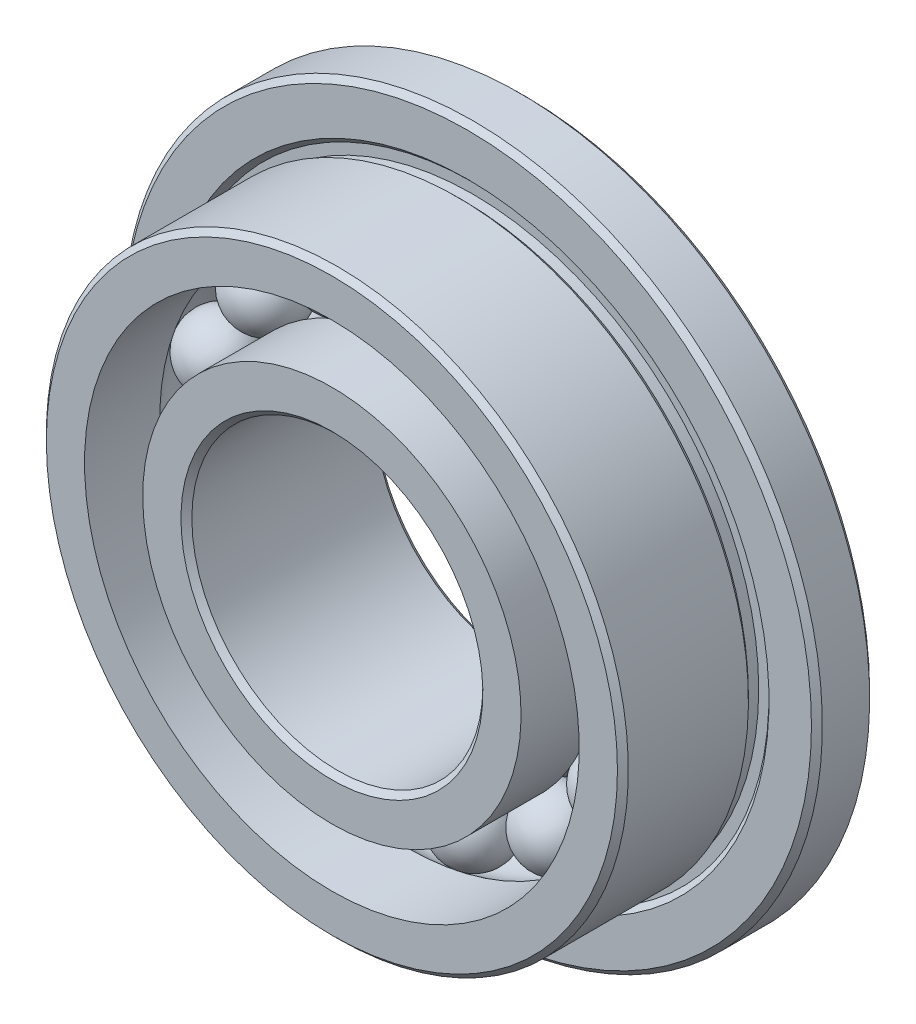
ISO-10303-21;
HEADER;
FILE_DESCRIPTION(('STEP AP214'),'2;1');
FILE_NAME('part.step','',(''),(''),'','','');
FILE_SCHEMA(('AUTOMOTIVE_DESIGN { 1 0 10303 214 1 1 1 1 }'));
ENDSEC;
DATA;
#1=APPLICATION_CONTEXT('core data for automotive mechanical design processes');
#2=APPLICATION_PROTOCOL_DEFINITION('international standard','automotive_design',2000,#1);
#3=PRODUCT_CONTEXT('',#1,'mechanical');
#4=PRODUCT('Part','Part','',(#3));
#5=PRODUCT_RELATED_PRODUCT_CATEGORY('part','',(#4));
#6=PRODUCT_DEFINITION_FORMATION('','',#4);
#7=PRODUCT_DEFINITION_CONTEXT('part definition',#1,'design');
#8=PRODUCT_DEFINITION('design','',#6,#7);
#9=PRODUCT_DEFINITION_SHAPE('','',#8);
#10=(LENGTH_UNIT() NAMED_UNIT(*) SI_UNIT(.MILLI.,.METRE.));
#11=(NAMED_UNIT(*) PLANE_ANGLE_UNIT() SI_UNIT($,.RADIAN.));
#12=(NAMED_UNIT(*) SI_UNIT($,.STERADIAN.) SOLID_ANGLE_UNIT());
#13=UNCERTAINTY_MEASURE_WITH_UNIT(LENGTH_MEASURE(1.E-05),#10,'distance_accuracy_value','');
#14=(GEOMETRIC_REPRESENTATION_CONTEXT(3) GLOBAL_UNCERTAINTY_ASSIGNED_CONTEXT((#13)) GLOBAL_UNIT_ASSIGNED_CONTEXT((#10,
#11,#12)) REPRESENTATION_CONTEXT('',''));
#15=CARTESIAN_POINT('',(0.,0.,0.));
#16=DIRECTION('',(0.,0.,1.));
#17=DIRECTION('',(1.,0.,0.));
#18=AXIS2_PLACEMENT_3D('',#15,#16,#17);
#19=CARTESIAN_POINT('',(-0.915157446920525,2.05547727969586,0.));
#20=DIRECTION('',(-0.406736643075789,0.913545457642606,0.));
#21=DIRECTION('',(0.913545457642606,0.406736643075789,0.));
#22=AXIS2_PLACEMENT_3D('',#19,#20,#21);
#23=SPHERICAL_SURFACE('',#22,0.375);
#24=CARTESIAN_POINT('',(-1.06768368807395,2.39805682631184,0.));
#25=VERTEX_POINT('',#24);
#26=VERTEX_LOOP('',#25);
#27=FACE_BOUND('',#26,.T.);
#28=ADVANCED_FACE('F43',(#27),#23,.T.);
#29=CLOSED_SHELL('',(#28));
#30=MANIFOLD_SOLID_BREP('B2',#29);
#31=CARTESIAN_POINT('',(-1.67207585732412,1.50554386430745,0.));
#32=DIRECTION('',(-0.743144825477386,0.669130606358867,0.));
#33=DIRECTION('',(0.669130606358867,0.743144825477386,0.));
#34=AXIS2_PLACEMENT_3D('',#31,#32,#33);
#35=SPHERICAL_SURFACE('',#34,0.375);
#36=CARTESIAN_POINT('',(-1.95075516687814,1.75646784169203,0.));
#37=VERTEX_POINT('',#36);
#38=VERTEX_LOOP('',#37);
#39=FACE_BOUND('',#38,.T.);
#40=ADVANCED_FACE('F62',(#39),#35,.T.);
#41=CLOSED_SHELL('',(#40));
#42=MANIFOLD_SOLID_BREP('B7',#41);
#43=CARTESIAN_POINT('',(-2.13987716166409,0.695288237343654,0.));
#44=DIRECTION('',(-0.95105651629515,0.309016994374957,0.));
#45=DIRECTION('',(0.309016994374957,0.95105651629515,0.));
#46=AXIS2_PLACEMENT_3D('',#43,#44,#45);
#47=SPHERICAL_SURFACE('',#46,0.375);
#48=CARTESIAN_POINT('',(-2.49652335527477,0.811169610234263,0.));
#49=VERTEX_POINT('',#48);
#50=VERTEX_LOOP('',#49);
#51=FACE_BOUND('',#50,.T.);
#52=ADVANCED_FACE('F81',(#51),#47,.T.);
#53=CLOSED_SHELL('',(#52));
#54=MANIFOLD_SOLID_BREP('B39',#53);
#55=CARTESIAN_POINT('',(-2.23767426457862,-0.235189042352198,0.));
#56=DIRECTION('',(-0.994521895368274,-0.104528463267644,0.));
#57=DIRECTION('',(-0.104528463267644,0.994521895368274,0.));
#58=AXIS2_PLACEMENT_3D('',#55,#56,#57);
#59=SPHERICAL_SURFACE('',#58,0.375);
#60=CARTESIAN_POINT('',(-2.61061997534172,-0.274387216077565,0.));
#61=VERTEX_POINT('',#60);
#62=VERTEX_LOOP('',#61);
#63=FACE_BOUND('',#62,.T.);
#64=ADVANCED_FACE('F100',(#63),#59,.T.);
#65=CLOSED_SHELL('',(#64));
#66=MANIFOLD_SOLID_BREP('B58',#65);
#67=CARTESIAN_POINT('',(-1.948557158515,-1.12499999999998,0.));
#68=DIRECTION('',(-0.866025403784443,-0.499999999999992,0.));
#69=DIRECTION('',(-0.499999999999992,0.866025403784443,0.));
#70=AXIS2_PLACEMENT_3D('',#67,#68,#69);
#71=SPHERICAL_SURFACE('',#70,0.375);
#72=CARTESIAN_POINT('',(-2.27331668493416,-1.31249999999998,0.));
#73=VERTEX_POINT('',#72);
#74=VERTEX_LOOP('',#73);
#75=FACE_BOUND('',#74,.T.);
#76=ADVANCED_FACE('F119',(#75),#71,.T.);
#77=CLOSED_SHELL('',(#76));
#78=MANIFOLD_SOLID_BREP('B77',#77);
#79=CARTESIAN_POINT('',(-1.32251681765808,-1.82028823734362,0.));
#80=DIRECTION('',(-0.58778525229248,-0.809016994374943,0.));
#81=DIRECTION('',(-0.809016994374943,0.58778525229248,0.));
#82=AXIS2_PLACEMENT_3D('',#79,#80,#81);
#83=SPHERICAL_SURFACE('',#82,0.375);
#84=CARTESIAN_POINT('',(-1.54293628726776,-2.12366961023422,0.));
#85=VERTEX_POINT('',#84);
#86=VERTEX_LOOP('',#85);
#87=FACE_BOUND('',#86,.T.);
#88=ADVANCED_FACE('F138',(#87),#83,.T.);
#89=CLOSED_SHELL('',(#88));
#90=MANIFOLD_SOLID_BREP('B96',#89);
#91=CARTESIAN_POINT('',(-0.467801304339975,-2.20083210165106,0.));
#92=DIRECTION('',(-0.207911690817766,-0.978147600733804,0.));
#93=DIRECTION('',(-0.978147600733804,0.207911690817766,0.));
#94=AXIS2_PLACEMENT_3D('',#91,#92,#93);
#95=SPHERICAL_SURFACE('',#94,0.375);
#96=CARTESIAN_POINT('',(-0.545768188396637,-2.56763745192624,0.));
#97=VERTEX_POINT('',#96);
#98=VERTEX_LOOP('',#97);
#99=FACE_BOUND('',#98,.T.);
#100=ADVANCED_FACE('F157',(#99),#95,.T.);
#101=CLOSED_SHELL('',(#100));
#102=MANIFOLD_SOLID_BREP('B115',#101);
#103=CARTESIAN_POINT('',(0.467801304339945,-2.20083210165107,0.));
#104=DIRECTION('',(0.207911690817753,-0.978147600733807,0.));
#105=DIRECTION('',(-0.978147600733807,-0.207911690817753,0.));
#106=AXIS2_PLACEMENT_3D('',#103,#104,#105);
#107=SPHERICAL_SURFACE('',#106,0.375);
#108=CARTESIAN_POINT('',(0.545768188396602,-2.56763745192624,0.));
#109=VERTEX_POINT('',#108);
#110=VERTEX_LOOP('',#109);
#111=FACE_BOUND('',#110,.T.);
#112=ADVANCED_FACE('F176',(#111),#107,.T.);
#113=CLOSED_SHELL('',(#112));
#114=MANIFOLD_SOLID_BREP('B134',#113);
#115=CARTESIAN_POINT('',(1.32251681765806,-1.82028823734364,0.));
#116=DIRECTION('',(0.587785252292469,-0.80901699437495,0.));
#117=DIRECTION('',(-0.80901699437495,-0.587785252292469,0.));
#118=AXIS2_PLACEMENT_3D('',#115,#116,#117);
#119=SPHERICAL_SURFACE('',#118,0.375);
#120=CARTESIAN_POINT('',(1.54293628726773,-2.12366961023424,0.));
#121=VERTEX_POINT('',#120);
#122=VERTEX_LOOP('',#121);
#123=FACE_BOUND('',#122,.T.);
#124=ADVANCED_FACE('F195',(#123),#119,.T.);
#125=CLOSED_SHELL('',(#124));
#126=MANIFOLD_SOLID_BREP('B153',#125);
#127=CARTESIAN_POINT('',(1.94855715851498,-1.12500000000001,0.));
#128=DIRECTION('',(0.866025403784437,-0.500000000000004,0.));
#129=DIRECTION('',(-0.500000000000004,-0.866025403784437,0.));
#130=AXIS2_PLACEMENT_3D('',#127,#128,#129);
#131=SPHERICAL_SURFACE('',#130,0.375);
#132=CARTESIAN_POINT('',(2.27331668493415,-1.31250000000001,0.));
#133=VERTEX_POINT('',#132);
#134=VERTEX_LOOP('',#133);
#135=FACE_BOUND('',#134,.T.);
#136=ADVANCED_FACE('F213',(#135),#131,.T.);
#137=CLOSED_SHELL('',(#136));
#138=MANIFOLD_SOLID_BREP('B172',#137);
#139=CARTESIAN_POINT('',(2.23767426457861,-0.235189042352228,0.));
#140=DIRECTION('',(0.994521895368273,-0.104528463267657,0.));
#141=DIRECTION('',(-0.104528463267657,-0.994521895368273,0.));
#142=AXIS2_PLACEMENT_3D('',#139,#140,#141);
#143=SPHERICAL_SURFACE('',#142,0.375);
#144=CARTESIAN_POINT('',(2.61061997534172,-0.2743872160776,0.));
#145=VERTEX_POINT('',#144);
#146=VERTEX_LOOP('',#145);
#147=FACE_BOUND('',#146,.T.);
#148=ADVANCED_FACE('F232',(#147),#143,.T.);
#149=CLOSED_SHELL('',(#148));
#150=MANIFOLD_SOLID_BREP('B191',#149);
#151=CARTESIAN_POINT('',(2.1398771616641,0.695288237343626,0.));
#152=DIRECTION('',(0.951056516295154,0.309016994374945,0.));
#153=DIRECTION('',(0.309016994374945,-0.951056516295154,0.));
#154=AXIS2_PLACEMENT_3D('',#151,#152,#153);
#155=SPHERICAL_SURFACE('',#154,0.375);
#156=CARTESIAN_POINT('',(2.49652335527478,0.811169610234231,0.));
#157=VERTEX_POINT('',#156);
#158=VERTEX_LOOP('',#157);
#159=FACE_BOUND('',#158,.T.);
#160=ADVANCED_FACE('F251',(#159),#155,.T.);
#161=CLOSED_SHELL('',(#160));
#162=MANIFOLD_SOLID_BREP('B209',#161);
#163=CARTESIAN_POINT('',(1.67207585732414,1.50554386430743,0.));
#164=DIRECTION('',(0.743144825477395,0.669130606358857,0.));
#165=DIRECTION('',(0.669130606358857,-0.743144825477395,0.));
#166=AXIS2_PLACEMENT_3D('',#163,#164,#165);
#167=SPHERICAL_SURFACE('',#166,0.375);
#168=CARTESIAN_POINT('',(1.95075516687816,1.756467841692,0.));
#169=VERTEX_POINT('',#168);
#170=VERTEX_LOOP('',#169);
#171=FACE_BOUND('',#170,.T.);
#172=ADVANCED_FACE('F269',(#171),#167,.T.);
#173=CLOSED_SHELL('',(#172));
#174=MANIFOLD_SOLID_BREP('B228',#173);
#175=CARTESIAN_POINT('',(0.915157446920552,2.05547727969585,0.));
#176=DIRECTION('',(0.406736643075801,0.913545457642601,0.));
#177=DIRECTION('',(0.913545457642601,-0.406736643075801,0.));
#178=AXIS2_PLACEMENT_3D('',#175,#176,#177);
#179=SPHERICAL_SURFACE('',#178,0.375);
#180=CARTESIAN_POINT('',(1.06768368807398,2.39805682631183,0.));
#181=VERTEX_POINT('',#180);
#182=VERTEX_LOOP('',#181);
#183=FACE_BOUND('',#182,.T.);
#184=ADVANCED_FACE('F287',(#183),#179,.T.);
#185=CLOSED_SHELL('',(#184));
#186=MANIFOLD_SOLID_BREP('B247',#185);
#187=CARTESIAN_POINT('',(0.,2.25,0.));
#188=DIRECTION('',(0.,1.,0.));
#189=DIRECTION('',(1.,0.,0.));
#190=AXIS2_PLACEMENT_3D('',#187,#188,#189);
#191=SPHERICAL_SURFACE('',#190,0.375);
#192=CARTESIAN_POINT('',(0.,2.625,0.));
#193=VERTEX_POINT('',#192);
#194=VERTEX_LOOP('',#193);
#195=FACE_BOUND('',#194,.T.);
#196=ADVANCED_FACE('F309',(#195),#191,.T.);
#197=CLOSED_SHELL('',(#196));
#198=MANIFOLD_SOLID_BREP('B265',#197);
#199=CARTESIAN_POINT('',(0.,0.,0.));
#200=DIRECTION('',(0.,0.,1.));
#201=DIRECTION('',(0.,-1.,0.));
#202=AXIS2_PLACEMENT_3D('',#199,#200,#201);
#203=CYLINDRICAL_SURFACE('',#202,1.95);
#204=CARTESIAN_POINT('',(0.,0.,-0.225000000000001));
#205=DIRECTION('',(0.,0.,1.));
#206=DIRECTION('',(0.,-1.,0.));
#207=AXIS2_PLACEMENT_3D('',#204,#205,#206);
#208=CIRCLE('',#207,1.95);
#209=CARTESIAN_POINT('',(0.,-1.95,-0.225000000000001));
#210=VERTEX_POINT('',#209);
#211=EDGE_CURVE('E357',#210,#210,#208,.T.);
#212=ORIENTED_EDGE('',*,*,#211,.F.);
#213=EDGE_LOOP('',(#212));
#214=FACE_BOUND('',#213,.T.);
#215=CARTESIAN_POINT('',(0.,0.,-1.));
#216=DIRECTION('',(0.,0.,1.));
#217=DIRECTION('',(0.,-1.,0.));
#218=AXIS2_PLACEMENT_3D('',#215,#216,#217);
#219=CIRCLE('',#218,1.95);
#220=CARTESIAN_POINT('',(0.,-1.95,-1.));
#221=VERTEX_POINT('',#220);
#222=EDGE_CURVE('E368',#221,#221,#219,.T.);
#223=ORIENTED_EDGE('',*,*,#222,.T.);
#224=EDGE_LOOP('',(#223));
#225=FACE_BOUND('',#224,.T.);
#226=ADVANCED_FACE('F331',(#214,#225),#203,.T.);
#227=CARTESIAN_POINT('',(0.,0.,0.));
#228=DIRECTION('',(0.,0.,1.));
#229=DIRECTION('',(0.,-1.,0.));
#230=AXIS2_PLACEMENT_3D('',#227,#228,#229);
#231=TOROIDAL_SURFACE('',#230,2.25,0.375);
#232=CARTESIAN_POINT('',(0.,0.,0.225));
#233=DIRECTION('',(0.,0.,1.));
#234=DIRECTION('',(0.,-1.,0.));
#235=AXIS2_PLACEMENT_3D('',#232,#233,#234);
#236=CIRCLE('',#235,1.95);
#237=CARTESIAN_POINT('',(0.,-1.95,0.225));
#238=VERTEX_POINT('',#237);
#239=EDGE_CURVE('E360',#238,#238,#236,.T.);
#240=ORIENTED_EDGE('',*,*,#239,.F.);
#241=EDGE_LOOP('',(#240));
#242=FACE_BOUND('',#241,.T.);
#243=ORIENTED_EDGE('',*,*,#211,.T.);
#244=EDGE_LOOP('',(#243));
#245=FACE_BOUND('',#244,.T.);
#246=ADVANCED_FACE('F387',(#242,#245),#231,.F.);
#247=CARTESIAN_POINT('',(0.,0.,0.));
#248=DIRECTION('',(0.,0.,1.));
#249=DIRECTION('',(0.,-1.,0.));
#250=AXIS2_PLACEMENT_3D('',#247,#248,#249);
#251=CYLINDRICAL_SURFACE('',#250,1.95);
#252=CARTESIAN_POINT('',(0.,0.,1.));
#253=DIRECTION('',(0.,0.,1.));
#254=DIRECTION('',(0.,-1.,0.));
#255=AXIS2_PLACEMENT_3D('',#252,#253,#254);
#256=CIRCLE('',#255,1.95);
#257=CARTESIAN_POINT('',(0.,-1.95,1.));
#258=VERTEX_POINT('',#257);
#259=EDGE_CURVE('E364',#258,#258,#256,.T.);
#260=ORIENTED_EDGE('',*,*,#259,.F.);
#261=EDGE_LOOP('',(#260));
#262=FACE_BOUND('',#261,.T.);
#263=ORIENTED_EDGE('',*,*,#239,.T.);
#264=EDGE_LOOP('',(#263));
#265=FACE_BOUND('',#264,.T.);
#266=ADVANCED_FACE('F393',(#262,#265),#251,.T.);
#267=CARTESIAN_POINT('',(0.,1.5,1.));
#268=DIRECTION('',(0.,0.,-1.));
#269=DIRECTION('',(0.,1.,0.));
#270=AXIS2_PLACEMENT_3D('',#267,#268,#269);
#271=PLANE('',#270);
#272=CARTESIAN_POINT('',(0.,0.,1.));
#273=DIRECTION('',(0.,0.,-1.));
#274=DIRECTION('',(0.,1.,0.));
#275=AXIS2_PLACEMENT_3D('',#272,#273,#274);
#276=CIRCLE('',#275,1.55625);
#277=CARTESIAN_POINT('',(0.,1.55625,1.));
#278=VERTEX_POINT('',#277);
#279=EDGE_CURVE('E308',#278,#278,#276,.T.);
#280=ORIENTED_EDGE('',*,*,#279,.T.);
#281=EDGE_LOOP('',(#280));
#282=FACE_BOUND('',#281,.T.);
#283=ORIENTED_EDGE('',*,*,#259,.T.);
#284=EDGE_LOOP('',(#283));
#285=FACE_BOUND('',#284,.T.);
#286=ADVANCED_FACE('F384',(#282,#285),#271,.F.);
#287=CARTESIAN_POINT('',(0.,0.,0.));
#288=DIRECTION('',(0.,0.,1.));
#289=DIRECTION('',(0.,-1.,0.));
#290=AXIS2_PLACEMENT_3D('',#287,#288,#289);
#291=CYLINDRICAL_SURFACE('',#290,1.5);
#292=CARTESIAN_POINT('',(0.,0.,-0.943750000000001));
#293=DIRECTION('',(0.,0.,1.));
#294=DIRECTION('',(0.,-1.,0.));
#295=AXIS2_PLACEMENT_3D('',#292,#293,#294);
#296=CIRCLE('',#295,1.5);
#297=CARTESIAN_POINT('',(0.,-1.5,-0.943750000000001));
#298=VERTEX_POINT('',#297);
#299=EDGE_CURVE('E339',#298,#298,#296,.F.);
#300=ORIENTED_EDGE('',*,*,#299,.T.);
#301=EDGE_LOOP('',(#300));
#302=FACE_BOUND('',#301,.T.);
#303=CARTESIAN_POINT('',(0.,0.,0.94375));
#304=DIRECTION('',(0.,0.,-1.));
#305=DIRECTION('',(0.,1.,0.));
#306=AXIS2_PLACEMENT_3D('',#303,#304,#305);
#307=CIRCLE('',#306,1.5);
#308=CARTESIAN_POINT('',(0.,1.5,0.94375));
#309=VERTEX_POINT('',#308);
#310=EDGE_CURVE('E346',#309,#309,#307,.F.);
#311=ORIENTED_EDGE('',*,*,#310,.T.);
#312=EDGE_LOOP('',(#311));
#313=FACE_BOUND('',#312,.T.);
#314=ADVANCED_FACE('F376',(#302,#313),#291,.F.);
#315=CARTESIAN_POINT('',(0.,1.95,-1.));
#316=DIRECTION('',(0.,0.,1.));
#317=DIRECTION('',(0.,-1.,0.));
#318=AXIS2_PLACEMENT_3D('',#315,#316,#317);
#319=PLANE('',#318);
#320=CARTESIAN_POINT('',(0.,0.,-1.));
#321=DIRECTION('',(0.,0.,1.));
#322=DIRECTION('',(0.,-1.,0.));
#323=AXIS2_PLACEMENT_3D('',#320,#321,#322);
#324=CIRCLE('',#323,1.55625);
#325=CARTESIAN_POINT('',(0.,-1.55625,-1.));
#326=VERTEX_POINT('',#325);
#327=EDGE_CURVE('E352',#326,#326,#324,.T.);
#328=ORIENTED_EDGE('',*,*,#327,.T.);
#329=EDGE_LOOP('',(#328));
#330=FACE_BOUND('',#329,.T.);
#331=ORIENTED_EDGE('',*,*,#222,.F.);
#332=EDGE_LOOP('',(#331));
#333=FACE_BOUND('',#332,.T.);
#334=ADVANCED_FACE('F373',(#330,#333),#319,.F.);
#335=CARTESIAN_POINT('',(0.,0.,-1.));
#336=DIRECTION('',(0.,0.,-1.));
#337=DIRECTION('',(0.,1.,0.));
#338=AXIS2_PLACEMENT_3D('',#335,#336,#337);
#339=CONICAL_SURFACE('',#338,1.55625,0.785398163397448);
#340=ORIENTED_EDGE('',*,*,#299,.F.);
#341=EDGE_LOOP('',(#340));
#342=FACE_BOUND('',#341,.T.);
#343=ORIENTED_EDGE('',*,*,#327,.F.);
#344=EDGE_LOOP('',(#343));
#345=FACE_BOUND('',#344,.T.);
#346=ADVANCED_FACE('F375',(#342,#345),#339,.F.);
#347=CARTESIAN_POINT('',(0.,0.,0.94375));
#348=DIRECTION('',(0.,0.,1.));
#349=DIRECTION('',(0.,-1.,0.));
#350=AXIS2_PLACEMENT_3D('',#347,#348,#349);
#351=CONICAL_SURFACE('',#350,1.5,0.78539816339745);
#352=ORIENTED_EDGE('',*,*,#279,.F.);
#353=EDGE_LOOP('',(#352));
#354=FACE_BOUND('',#353,.T.);
#355=ORIENTED_EDGE('',*,*,#310,.F.);
#356=EDGE_LOOP('',(#355));
#357=FACE_BOUND('',#356,.T.);
#358=ADVANCED_FACE('F333',(#354,#357),#351,.F.);
#359=CLOSED_SHELL('',(#226,#246,#266,#286,#314,#334,#346,#358));
#360=MANIFOLD_SOLID_BREP('B283',#359);
#361=CARTESIAN_POINT('',(0.,2.55,-1.));
#362=DIRECTION('',(0.,0.,1.));
#363=DIRECTION('',(0.,-1.,0.));
#364=AXIS2_PLACEMENT_3D('',#361,#362,#363);
#365=PLANE('',#364);
#366=CARTESIAN_POINT('',(0.,0.,-1.));
#367=DIRECTION('',(0.,0.,1.));
#368=DIRECTION('',(0.,-1.,0.));
#369=AXIS2_PLACEMENT_3D('',#366,#367,#368);
#370=CIRCLE('',#369,3.54375);
#371=CARTESIAN_POINT('',(0.,-3.54375,-1.));
#372=VERTEX_POINT('',#371);
#373=EDGE_CURVE('E488',#372,#372,#370,.F.);
#374=ORIENTED_EDGE('',*,*,#373,.T.);
#375=EDGE_LOOP('',(#374));
#376=FACE_BOUND('',#375,.T.);
#377=CARTESIAN_POINT('',(0.,0.,-1.));
#378=DIRECTION('',(0.,0.,1.));
#379=DIRECTION('',(0.,-1.,0.));
#380=AXIS2_PLACEMENT_3D('',#377,#378,#379);
#381=CIRCLE('',#380,2.55);
#382=CARTESIAN_POINT('',(0.,-2.55,-1.));
#383=VERTEX_POINT('',#382);
#384=EDGE_CURVE('E501',#383,#383,#381,.T.);
#385=ORIENTED_EDGE('',*,*,#384,.T.);
#386=EDGE_LOOP('',(#385));
#387=FACE_BOUND('',#386,.T.);
#388=ADVANCED_FACE('F469',(#376,#387),#365,.F.);
#389=CARTESIAN_POINT('',(0.,0.,0.));
#390=DIRECTION('',(0.,0.,1.));
#391=DIRECTION('',(0.,-1.,0.));
#392=AXIS2_PLACEMENT_3D('',#389,#390,#391);
#393=CYLINDRICAL_SURFACE('',#392,2.55);
#394=ORIENTED_EDGE('',*,*,#384,.F.);
#395=EDGE_LOOP('',(#394));
#396=FACE_BOUND('',#395,.T.);
#397=CARTESIAN_POINT('',(0.,0.,-0.225000000000001));
#398=DIRECTION('',(0.,0.,1.));
#399=DIRECTION('',(0.,-1.,0.));
#400=AXIS2_PLACEMENT_3D('',#397,#398,#399);
#401=CIRCLE('',#400,2.55);
#402=CARTESIAN_POINT('',(0.,-2.55,-0.225000000000001));
#403=VERTEX_POINT('',#402);
#404=EDGE_CURVE('E505',#403,#403,#401,.T.);
#405=ORIENTED_EDGE('',*,*,#404,.T.);
#406=EDGE_LOOP('',(#405));
#407=FACE_BOUND('',#406,.T.);
#408=ADVANCED_FACE('F556',(#396,#407),#393,.F.);
#409=CARTESIAN_POINT('',(0.,0.,0.));
#410=DIRECTION('',(0.,0.,1.));
#411=DIRECTION('',(0.,-1.,0.));
#412=AXIS2_PLACEMENT_3D('',#409,#410,#411);
#413=TOROIDAL_SURFACE('',#412,2.25,0.375);
#414=ORIENTED_EDGE('',*,*,#404,.F.);
#415=EDGE_LOOP('',(#414));
#416=FACE_BOUND('',#415,.T.);
#417=CARTESIAN_POINT('',(0.,0.,0.225));
#418=DIRECTION('',(0.,0.,1.));
#419=DIRECTION('',(0.,-1.,0.));
#420=AXIS2_PLACEMENT_3D('',#417,#418,#419);
#421=CIRCLE('',#420,2.55);
#422=CARTESIAN_POINT('',(0.,-2.55,0.225));
#423=VERTEX_POINT('',#422);
#424=EDGE_CURVE('E509',#423,#423,#421,.T.);
#425=ORIENTED_EDGE('',*,*,#424,.T.);
#426=EDGE_LOOP('',(#425));
#427=FACE_BOUND('',#426,.T.);
#428=ADVANCED_FACE('F562',(#416,#427),#413,.F.);
#429=CARTESIAN_POINT('',(0.,0.,0.));
#430=DIRECTION('',(0.,0.,1.));
#431=DIRECTION('',(0.,-1.,0.));
#432=AXIS2_PLACEMENT_3D('',#429,#430,#431);
#433=CYLINDRICAL_SURFACE('',#432,2.55);
#434=ORIENTED_EDGE('',*,*,#424,.F.);
#435=EDGE_LOOP('',(#434));
#436=FACE_BOUND('',#435,.T.);
#437=CARTESIAN_POINT('',(0.,0.,1.));
#438=DIRECTION('',(0.,0.,1.));
#439=DIRECTION('',(0.,-1.,0.));
#440=AXIS2_PLACEMENT_3D('',#437,#438,#439);
#441=CIRCLE('',#440,2.55);
#442=CARTESIAN_POINT('',(0.,-2.55,1.));
#443=VERTEX_POINT('',#442);
#444=EDGE_CURVE('E513',#443,#443,#441,.T.);
#445=ORIENTED_EDGE('',*,*,#444,.T.);
#446=EDGE_LOOP('',(#445));
#447=FACE_BOUND('',#446,.T.);
#448=ADVANCED_FACE('F605',(#436,#447),#433,.F.);
#449=CARTESIAN_POINT('',(0.,3.,1.));
#450=DIRECTION('',(0.,0.,-1.));
#451=DIRECTION('',(0.,1.,0.));
#452=AXIS2_PLACEMENT_3D('',#449,#450,#451);
#453=PLANE('',#452);
#454=CARTESIAN_POINT('',(0.,0.,1.));
#455=DIRECTION('',(0.,0.,-1.));
#456=DIRECTION('',(0.,1.,0.));
#457=AXIS2_PLACEMENT_3D('',#454,#455,#456);
#458=CIRCLE('',#457,2.94375);
#459=CARTESIAN_POINT('',(0.,2.94375,1.));
#460=VERTEX_POINT('',#459);
#461=EDGE_CURVE('E477',#460,#460,#458,.F.);
#462=ORIENTED_EDGE('',*,*,#461,.T.);
#463=EDGE_LOOP('',(#462));
#464=FACE_BOUND('',#463,.T.);
#465=ORIENTED_EDGE('',*,*,#444,.F.);
#466=EDGE_LOOP('',(#465));
#467=FACE_BOUND('',#466,.T.);
#468=ADVANCED_FACE('F633',(#464,#467),#453,.F.);
#469=CARTESIAN_POINT('',(0.,0.,0.));
#470=DIRECTION('',(0.,0.,1.));
#471=DIRECTION('',(0.,-1.,0.));
#472=AXIS2_PLACEMENT_3D('',#469,#470,#471);
#473=CYLINDRICAL_SURFACE('',#472,3.);
#474=CARTESIAN_POINT('',(0.,0.,0.94375));
#475=DIRECTION('',(0.,0.,-1.));
#476=DIRECTION('',(0.,1.,0.));
#477=AXIS2_PLACEMENT_3D('',#474,#475,#476);
#478=CIRCLE('',#477,3.);
#479=CARTESIAN_POINT('',(0.,3.,0.94375));
#480=VERTEX_POINT('',#479);
#481=EDGE_CURVE('E330',#480,#480,#478,.T.);
#482=ORIENTED_EDGE('',*,*,#481,.T.);
#483=EDGE_LOOP('',(#482));
#484=FACE_BOUND('',#483,.T.);
#485=CARTESIAN_POINT('',(0.,0.,-0.293933982822018));
#486=DIRECTION('',(0.,0.,1.));
#487=DIRECTION('',(0.,-1.,0.));
#488=AXIS2_PLACEMENT_3D('',#485,#486,#487);
#489=CIRCLE('',#488,3.);
#490=CARTESIAN_POINT('',(0.,-3.,-0.293933982822019));
#491=VERTEX_POINT('',#490);
#492=EDGE_CURVE('E517',#491,#491,#489,.T.);
#493=ORIENTED_EDGE('',*,*,#492,.T.);
#494=EDGE_LOOP('',(#493));
#495=FACE_BOUND('',#494,.T.);
#496=ADVANCED_FACE('F636',(#484,#495),#473,.T.);
#497=CARTESIAN_POINT('',(0.,0.,-0.34696699141101));
#498=DIRECTION('',(0.,0.,1.));
#499=DIRECTION('',(0.,-1.,0.));
#500=AXIS2_PLACEMENT_3D('',#497,#498,#499);
#501=CONICAL_SURFACE('',#500,2.94696699141101,0.785398163397442);
#502=ORIENTED_EDGE('',*,*,#492,.F.);
#503=EDGE_LOOP('',(#502));
#504=FACE_BOUND('',#503,.T.);
#505=CARTESIAN_POINT('',(0.,0.,-0.34696699141101));
#506=DIRECTION('',(0.,0.,1.));
#507=DIRECTION('',(0.,-1.,0.));
#508=AXIS2_PLACEMENT_3D('',#505,#506,#507);
#509=CIRCLE('',#508,2.94696699141101);
#510=CARTESIAN_POINT('',(0.,-2.94696699141101,-0.34696699141101));
#511=VERTEX_POINT('',#510);
#512=EDGE_CURVE('E521',#511,#511,#509,.T.);
#513=ORIENTED_EDGE('',*,*,#512,.T.);
#514=EDGE_LOOP('',(#513));
#515=FACE_BOUND('',#514,.T.);
#516=ADVANCED_FACE('F616',(#504,#515),#501,.T.);
#517=CARTESIAN_POINT('',(0.,0.,0.));
#518=DIRECTION('',(0.,0.,1.));
#519=DIRECTION('',(0.,-1.,0.));
#520=AXIS2_PLACEMENT_3D('',#517,#518,#519);
#521=CYLINDRICAL_SURFACE('',#520,2.94696699141101);
#522=ORIENTED_EDGE('',*,*,#512,.F.);
#523=EDGE_LOOP('',(#522));
#524=FACE_BOUND('',#523,.T.);
#525=CARTESIAN_POINT('',(0.,0.,-0.453033008588993));
#526=DIRECTION('',(0.,0.,1.));
#527=DIRECTION('',(0.,-1.,0.));
#528=AXIS2_PLACEMENT_3D('',#525,#526,#527);
#529=CIRCLE('',#528,2.94696699141101);
#530=CARTESIAN_POINT('',(0.,-2.94696699141101,-0.453033008588993));
#531=VERTEX_POINT('',#530);
#532=EDGE_CURVE('E525',#531,#531,#529,.T.);
#533=ORIENTED_EDGE('',*,*,#532,.T.);
#534=EDGE_LOOP('',(#533));
#535=FACE_BOUND('',#534,.T.);
#536=ADVANCED_FACE('F612',(#524,#535),#521,.T.);
#537=CARTESIAN_POINT('',(0.,3.05303300858899,-0.453033008588992));
#538=DIRECTION('',(0.,0.,-1.));
#539=DIRECTION('',(0.,1.,0.));
#540=AXIS2_PLACEMENT_3D('',#537,#538,#539);
#541=PLANE('',#540);
#542=ORIENTED_EDGE('',*,*,#532,.F.);
#543=EDGE_LOOP('',(#542));
#544=FACE_BOUND('',#543,.T.);
#545=CARTESIAN_POINT('',(0.,0.,-0.453033008588992));
#546=DIRECTION('',(0.,0.,1.));
#547=DIRECTION('',(0.,-1.,0.));
#548=AXIS2_PLACEMENT_3D('',#545,#546,#547);
#549=CIRCLE('',#548,3.05303300858899);
#550=CARTESIAN_POINT('',(0.,-3.05303300858899,-0.453033008588993));
#551=VERTEX_POINT('',#550);
#552=EDGE_CURVE('E529',#551,#551,#549,.T.);
#553=ORIENTED_EDGE('',*,*,#552,.T.);
#554=EDGE_LOOP('',(#553));
#555=FACE_BOUND('',#554,.T.);
#556=ADVANCED_FACE('F552',(#544,#555),#541,.F.);
#557=CARTESIAN_POINT('',(0.,0.,-0.400000000000001));
#558=DIRECTION('',(0.,0.,1.));
#559=DIRECTION('',(0.,-1.,0.));
#560=AXIS2_PLACEMENT_3D('',#557,#558,#559);
#561=CONICAL_SURFACE('',#560,3.10606601717798,0.785398163397447);
#562=ORIENTED_EDGE('',*,*,#552,.F.);
#563=EDGE_LOOP('',(#562));
#564=FACE_BOUND('',#563,.T.);
#565=CARTESIAN_POINT('',(0.,0.,-0.400000000000001));
#566=DIRECTION('',(0.,0.,1.));
#567=DIRECTION('',(0.,-1.,0.));
#568=AXIS2_PLACEMENT_3D('',#565,#566,#567);
#569=CIRCLE('',#568,3.10606601717798);
#570=CARTESIAN_POINT('',(0.,-3.10606601717798,-0.400000000000001));
#571=VERTEX_POINT('',#570);
#572=EDGE_CURVE('E533',#571,#571,#569,.T.);
#573=ORIENTED_EDGE('',*,*,#572,.T.);
#574=EDGE_LOOP('',(#573));
#575=FACE_BOUND('',#574,.T.);
#576=ADVANCED_FACE('F538',(#564,#575),#561,.F.);
#577=CARTESIAN_POINT('',(0.,3.6,-0.400000000000001));
#578=DIRECTION('',(0.,0.,-1.));
#579=DIRECTION('',(0.,1.,0.));
#580=AXIS2_PLACEMENT_3D('',#577,#578,#579);
#581=PLANE('',#580);
#582=CARTESIAN_POINT('',(0.,0.,-0.400000000000001));
#583=DIRECTION('',(0.,0.,-1.));
#584=DIRECTION('',(0.,1.,0.));
#585=AXIS2_PLACEMENT_3D('',#582,#583,#584);
#586=CIRCLE('',#585,3.54375);
#587=CARTESIAN_POINT('',(0.,3.54375,-0.400000000000001));
#588=VERTEX_POINT('',#587);
#589=EDGE_CURVE('E482',#588,#588,#586,.F.);
#590=ORIENTED_EDGE('',*,*,#589,.T.);
#591=EDGE_LOOP('',(#590));
#592=FACE_BOUND('',#591,.T.);
#593=ORIENTED_EDGE('',*,*,#572,.F.);
#594=EDGE_LOOP('',(#593));
#595=FACE_BOUND('',#594,.T.);
#596=ADVANCED_FACE('F540',(#592,#595),#581,.F.);
#597=CARTESIAN_POINT('',(0.,0.,0.));
#598=DIRECTION('',(0.,0.,1.));
#599=DIRECTION('',(0.,-1.,0.));
#600=AXIS2_PLACEMENT_3D('',#597,#598,#599);
#601=CYLINDRICAL_SURFACE('',#600,3.6);
#602=CARTESIAN_POINT('',(0.,0.,-0.943750000000001));
#603=DIRECTION('',(0.,0.,1.));
#604=DIRECTION('',(0.,-1.,0.));
#605=AXIS2_PLACEMENT_3D('',#602,#603,#604);
#606=CIRCLE('',#605,3.6);
#607=CARTESIAN_POINT('',(0.,-3.6,-0.943750000000001));
#608=VERTEX_POINT('',#607);
#609=EDGE_CURVE('E494',#608,#608,#606,.T.);
#610=CARTESIAN_POINT('',(0.,0.,-0.456250000000001));
#611=DIRECTION('',(0.,0.,-1.));
#612=DIRECTION('',(0.,1.,0.));
#613=AXIS2_PLACEMENT_3D('',#610,#611,#612);
#614=CIRCLE('',#613,3.6);
#615=CARTESIAN_POINT('',(0.,-3.6,-0.456250000000001));
#616=VERTEX_POINT('',#615);
#617=EDGE_CURVE('E498',#616,#616,#614,.T.);
#618=CARTESIAN_POINT('',(0.,-3.6,-0.943750000000001));
#619=CARTESIAN_POINT('',(0.,-3.6,-0.938671875000001));
#620=CARTESIAN_POINT('',(0.,-3.6,-0.933593750000001));
#621=CARTESIAN_POINT('',(0.,-3.6,-0.923437500000001));
#622=CARTESIAN_POINT('',(0.,-3.6,-0.918359375000001));
#623=CARTESIAN_POINT('',(0.,-3.6,-0.908203125000001));
#624=CARTESIAN_POINT('',(0.,-3.6,-0.903125000000001));
#625=CARTESIAN_POINT('',(0.,-3.6,-0.892968750000001));
#626=CARTESIAN_POINT('',(0.,-3.6,-0.887890625000001));
#627=CARTESIAN_POINT('',(0.,-3.6,-0.877734375000001));
#628=CARTESIAN_POINT('',(0.,-3.6,-0.872656250000001));
#629=CARTESIAN_POINT('',(0.,-3.6,-0.862500000000001));
#630=CARTESIAN_POINT('',(0.,-3.6,-0.857421875000001));
#631=CARTESIAN_POINT('',(0.,-3.6,-0.847265625000001));
#632=CARTESIAN_POINT('',(0.,-3.6,-0.842187500000001));
#633=CARTESIAN_POINT('',(0.,-3.6,-0.832031250000001));
#634=CARTESIAN_POINT('',(0.,-3.6,-0.826953125000001));
#635=CARTESIAN_POINT('',(0.,-3.6,-0.816796875000001));
#636=CARTESIAN_POINT('',(0.,-3.6,-0.811718750000001));
#637=CARTESIAN_POINT('',(0.,-3.6,-0.801562500000001));
#638=CARTESIAN_POINT('',(0.,-3.6,-0.796484375000001));
#639=CARTESIAN_POINT('',(0.,-3.6,-0.786328125000001));
#640=CARTESIAN_POINT('',(0.,-3.6,-0.781250000000001));
#641=CARTESIAN_POINT('',(0.,-3.6,-0.771093750000001));
#642=CARTESIAN_POINT('',(0.,-3.6,-0.766015625000001));
#643=CARTESIAN_POINT('',(0.,-3.6,-0.755859375000001));
#644=CARTESIAN_POINT('',(0.,-3.6,-0.750781250000001));
#645=CARTESIAN_POINT('',(0.,-3.6,-0.740625000000001));
#646=CARTESIAN_POINT('',(0.,-3.6,-0.735546875000001));
#647=CARTESIAN_POINT('',(0.,-3.6,-0.725390625000001));
#648=CARTESIAN_POINT('',(0.,-3.6,-0.720312500000001));
#649=CARTESIAN_POINT('',(0.,-3.6,-0.710156250000001));
#650=CARTESIAN_POINT('',(0.,-3.6,-0.705078125000001));
#651=CARTESIAN_POINT('',(0.,-3.6,-0.694921875000001));
#652=CARTESIAN_POINT('',(0.,-3.6,-0.689843750000001));
#653=CARTESIAN_POINT('',(0.,-3.6,-0.679687500000001));
#654=CARTESIAN_POINT('',(0.,-3.6,-0.674609375000001));
#655=CARTESIAN_POINT('',(0.,-3.6,-0.664453125000001));
#656=CARTESIAN_POINT('',(0.,-3.6,-0.659375000000001));
#657=CARTESIAN_POINT('',(0.,-3.6,-0.649218750000001));
#658=CARTESIAN_POINT('',(0.,-3.6,-0.644140625000001));
#659=CARTESIAN_POINT('',(0.,-3.6,-0.633984375000001));
#660=CARTESIAN_POINT('',(0.,-3.6,-0.628906250000001));
#661=CARTESIAN_POINT('',(0.,-3.6,-0.618750000000001));
#662=CARTESIAN_POINT('',(0.,-3.6,-0.613671875000001));
#663=CARTESIAN_POINT('',(0.,-3.6,-0.603515625000001));
#664=CARTESIAN_POINT('',(0.,-3.6,-0.598437500000001));
#665=CARTESIAN_POINT('',(0.,-3.6,-0.588281250000001));
#666=CARTESIAN_POINT('',(0.,-3.6,-0.583203125000001));
#667=CARTESIAN_POINT('',(0.,-3.6,-0.573046875000001));
#668=CARTESIAN_POINT('',(0.,-3.6,-0.567968750000001));
#669=CARTESIAN_POINT('',(0.,-3.6,-0.557812500000001));
#670=CARTESIAN_POINT('',(0.,-3.6,-0.552734375000001));
#671=CARTESIAN_POINT('',(0.,-3.6,-0.542578125000001));
#672=CARTESIAN_POINT('',(0.,-3.6,-0.537500000000001));
#673=CARTESIAN_POINT('',(0.,-3.6,-0.527343750000001));
#674=CARTESIAN_POINT('',(0.,-3.6,-0.522265625000001));
#675=CARTESIAN_POINT('',(0.,-3.6,-0.512109375000001));
#676=CARTESIAN_POINT('',(0.,-3.6,-0.507031250000001));
#677=CARTESIAN_POINT('',(0.,-3.6,-0.496875000000001));
#678=CARTESIAN_POINT('',(0.,-3.6,-0.491796875000001));
#679=CARTESIAN_POINT('',(0.,-3.6,-0.481640625000001));
#680=CARTESIAN_POINT('',(0.,-3.6,-0.476562500000001));
#681=CARTESIAN_POINT('',(0.,-3.6,-0.466406250000001));
#682=CARTESIAN_POINT('',(0.,-3.6,-0.461328125000001));
#683=CARTESIAN_POINT('',(0.,-3.6,-0.456250000000001));
#684=B_SPLINE_CURVE_WITH_KNOTS('',3,(#618,#619,#620,#621,#622,#623,#624,#625,#626,#627,#628,
#629,#630,#631,#632,#633,#634,#635,#636,#637,#638,#639,#640,#641,#642,#643,#644,#645,#646,#647,
#648,#649,#650,#651,#652,#653,#654,#655,#656,#657,#658,#659,#660,#661,#662,#663,#664,#665,#666,
#667,#668,#669,#670,#671,#672,#673,#674,#675,#676,#677,#678,#679,#680,#681,#682,#683),
.UNSPECIFIED.,.F.,.F.,(4,2,2,2,2,2,2,2,2,2,2,2,2,2,2,2,2,2,2,2,2,2,2,2,2,2,2,2,2,2,2,2,4),(0.,
0.0152343750000001,0.03046875,0.045703125,0.0609375,0.0761718750000001,0.09140625,0.106640625,
0.121875,0.137109375,0.15234375,0.167578125,0.1828125,0.198046875,0.21328125,0.228515625,
0.24375,0.258984375,0.27421875,0.289453125,0.3046875,0.319921875,0.33515625,0.350390625,
0.365625,0.380859375,0.39609375,0.411328125,0.4265625,0.441796875,0.45703125,0.472265625,
0.4875),.UNSPECIFIED.);
#685=EDGE_CURVE('BSEAM542',#608,#616,#684,.T.);
#686=ORIENTED_EDGE('',*,*,#609,.T.);
#687=ORIENTED_EDGE('',*,*,#617,.T.);
#688=ORIENTED_EDGE('',*,*,#685,.T.);
#689=ORIENTED_EDGE('',*,*,#685,.F.);
#690=EDGE_LOOP('',(#686,#688,#687,#689));
#691=FACE_BOUND('',#690,.T.);
#692=ADVANCED_FACE('F542',(#691),#601,.T.);
#693=CARTESIAN_POINT('',(0.,0.,-0.943750000000001));
#694=DIRECTION('',(0.,0.,1.));
#695=DIRECTION('',(0.,-1.,0.));
#696=AXIS2_PLACEMENT_3D('',#693,#694,#695);
#697=CONICAL_SURFACE('',#696,3.6,0.785398163397447);
#698=CARTESIAN_POINT('',(0.,-3.54375,-1.));
#699=CARTESIAN_POINT('',(0.,-3.5443359375,-0.999414062500001));
#700=CARTESIAN_POINT('',(0.,-3.544921875,-0.998828125000001));
#701=CARTESIAN_POINT('',(0.,-3.54609375,-0.997656250000001));
#702=CARTESIAN_POINT('',(0.,-3.5466796875,-0.997070312500001));
#703=CARTESIAN_POINT('',(0.,-3.5478515625,-0.995898437500001));
#704=CARTESIAN_POINT('',(0.,-3.5484375,-0.995312500000001));
#705=CARTESIAN_POINT('',(0.,-3.549609375,-0.994140625000001));
#706=CARTESIAN_POINT('',(0.,-3.5501953125,-0.993554687500001));
#707=CARTESIAN_POINT('',(0.,-3.5513671875,-0.992382812500001));
#708=CARTESIAN_POINT('',(0.,-3.551953125,-0.991796875000001));
#709=CARTESIAN_POINT('',(0.,-3.553125,-0.990625000000001));
#710=CARTESIAN_POINT('',(0.,-3.5537109375,-0.990039062500001));
#711=CARTESIAN_POINT('',(0.,-3.5548828125,-0.988867187500001));
#712=CARTESIAN_POINT('',(0.,-3.55546875,-0.988281250000001));
#713=CARTESIAN_POINT('',(0.,-3.556640625,-0.987109375000001));
#714=CARTESIAN_POINT('',(0.,-3.5572265625,-0.986523437500001));
#715=CARTESIAN_POINT('',(0.,-3.5583984375,-0.985351562500001));
#716=CARTESIAN_POINT('',(0.,-3.558984375,-0.984765625000001));
#717=CARTESIAN_POINT('',(0.,-3.56015625,-0.983593750000001));
#718=CARTESIAN_POINT('',(0.,-3.5607421875,-0.983007812500001));
#719=CARTESIAN_POINT('',(0.,-3.5619140625,-0.981835937500001));
#720=CARTESIAN_POINT('',(0.,-3.5625,-0.981250000000001));
#721=CARTESIAN_POINT('',(0.,-3.563671875,-0.980078125000001));
#722=CARTESIAN_POINT('',(0.,-3.5642578125,-0.979492187500001));
#723=CARTESIAN_POINT('',(0.,-3.5654296875,-0.978320312500001));
#724=CARTESIAN_POINT('',(0.,-3.566015625,-0.977734375000001));
#725=CARTESIAN_POINT('',(0.,-3.5671875,-0.976562500000001));
#726=CARTESIAN_POINT('',(0.,-3.5677734375,-0.975976562500001));
#727=CARTESIAN_POINT('',(0.,-3.5689453125,-0.974804687500001));
#728=CARTESIAN_POINT('',(0.,-3.56953125,-0.974218750000001));
#729=CARTESIAN_POINT('',(0.,-3.570703125,-0.973046875000001));
#730=CARTESIAN_POINT('',(0.,-3.5712890625,-0.972460937500001));
#731=CARTESIAN_POINT('',(0.,-3.5724609375,-0.971289062500001));
#732=CARTESIAN_POINT('',(0.,-3.573046875,-0.970703125000001));
#733=CARTESIAN_POINT('',(0.,-3.57421875,-0.969531250000001));
#734=CARTESIAN_POINT('',(0.,-3.5748046875,-0.968945312500001));
#735=CARTESIAN_POINT('',(0.,-3.5759765625,-0.967773437500001));
#736=CARTESIAN_POINT('',(0.,-3.5765625,-0.967187500000001));
#737=CARTESIAN_POINT('',(0.,-3.577734375,-0.966015625000001));
#738=CARTESIAN_POINT('',(0.,-3.5783203125,-0.965429687500001));
#739=CARTESIAN_POINT('',(0.,-3.5794921875,-0.964257812500001));
#740=CARTESIAN_POINT('',(0.,-3.580078125,-0.963671875000001));
#741=CARTESIAN_POINT('',(0.,-3.58125,-0.962500000000001));
#742=CARTESIAN_POINT('',(0.,-3.5818359375,-0.961914062500001));
#743=CARTESIAN_POINT('',(0.,-3.5830078125,-0.960742187500001));
#744=CARTESIAN_POINT('',(0.,-3.58359375,-0.960156250000001));
#745=CARTESIAN_POINT('',(0.,-3.584765625,-0.958984375000001));
#746=CARTESIAN_POINT('',(0.,-3.5853515625,-0.958398437500001));
#747=CARTESIAN_POINT('',(0.,-3.5865234375,-0.957226562500001));
#748=CARTESIAN_POINT('',(0.,-3.587109375,-0.956640625000001));
#749=CARTESIAN_POINT('',(0.,-3.58828125,-0.955468750000001));
#750=CARTESIAN_POINT('',(0.,-3.5888671875,-0.954882812500001));
#751=CARTESIAN_POINT('',(0.,-3.5900390625,-0.953710937500001));
#752=CARTESIAN_POINT('',(0.,-3.590625,-0.953125000000001));
#753=CARTESIAN_POINT('',(0.,-3.591796875,-0.951953125000001));
#754=CARTESIAN_POINT('',(0.,-3.5923828125,-0.951367187500001));
#755=CARTESIAN_POINT('',(0.,-3.5935546875,-0.950195312500001));
#756=CARTESIAN_POINT('',(0.,-3.594140625,-0.949609375000001));
#757=CARTESIAN_POINT('',(0.,-3.5953125,-0.948437500000001));
#758=CARTESIAN_POINT('',(0.,-3.5958984375,-0.947851562500001));
#759=CARTESIAN_POINT('',(0.,-3.5970703125,-0.946679687500001));
#760=CARTESIAN_POINT('',(0.,-3.59765625,-0.946093750000001));
#761=CARTESIAN_POINT('',(0.,-3.598828125,-0.944921875000001));
#762=CARTESIAN_POINT('',(0.,-3.5994140625,-0.944335937500001));
#763=CARTESIAN_POINT('',(0.,-3.6,-0.943750000000001));
#764=B_SPLINE_CURVE_WITH_KNOTS('',3,(#698,#699,#700,#701,#702,#703,#704,#705,#706,#707,#708,
#709,#710,#711,#712,#713,#714,#715,#716,#717,#718,#719,#720,#721,#722,#723,#724,#725,#726,#727,
#728,#729,#730,#731,#732,#733,#734,#735,#736,#737,#738,#739,#740,#741,#742,#743,#744,#745,#746,
#747,#748,#749,#750,#751,#752,#753,#754,#755,#756,#757,#758,#759,#760,#761,#762,#763),
.UNSPECIFIED.,.F.,.F.,(4,2,2,2,2,2,2,2,2,2,2,2,2,2,2,2,2,2,2,2,2,2,2,2,2,2,2,2,2,2,2,2,4),(0.,
0.00248592227760868,0.00497184455521782,0.00745776683282666,0.0099436891104358,
0.0124296113880446,0.0149155336656538,0.0174014559432626,0.0198873782208718,0.0223733004984806,
0.0248592227760894,0.0273451450536984,0.0298310673313073,0.0323169896089164,0.0348029118865252,
0.0372888341641344,0.0397747564417432,0.0422606787193524,0.0447466009969611,0.04723252327457,
0.0497184455521791,0.0522043678297879,0.0546902901073971,0.0571762123850058,0.059662134662615,
0.0621480569402238,0.0646339792178326,0.0671199014954418,0.0696058237730505,0.0720917460506597,
0.0745776683282685,0.0770635906058777,0.0795495128834864),.UNSPECIFIED.);
#765=EDGE_CURVE('BSEAM549',#372,#608,#764,.T.);
#766=ORIENTED_EDGE('',*,*,#373,.F.);
#767=ORIENTED_EDGE('',*,*,#609,.F.);
#768=ORIENTED_EDGE('',*,*,#765,.T.);
#769=ORIENTED_EDGE('',*,*,#765,.F.);
#770=EDGE_LOOP('',(#766,#768,#767,#769));
#771=FACE_BOUND('',#770,.T.);
#772=ADVANCED_FACE('F549',(#771),#697,.T.);
#773=CARTESIAN_POINT('',(0.,0.,-0.400000000000001));
#774=DIRECTION('',(0.,0.,-1.));
#775=DIRECTION('',(0.,1.,0.));
#776=AXIS2_PLACEMENT_3D('',#773,#774,#775);
#777=CONICAL_SURFACE('',#776,3.54375,0.785398163397447);
#778=ORIENTED_EDGE('',*,*,#617,.F.);
#779=EDGE_LOOP('',(#778));
#780=FACE_BOUND('',#779,.T.);
#781=ORIENTED_EDGE('',*,*,#589,.F.);
#782=EDGE_LOOP('',(#781));
#783=FACE_BOUND('',#782,.T.);
#784=ADVANCED_FACE('F569',(#780,#783),#777,.T.);
#785=CARTESIAN_POINT('',(0.,0.,1.));
#786=DIRECTION('',(0.,0.,-1.));
#787=DIRECTION('',(0.,1.,0.));
#788=AXIS2_PLACEMENT_3D('',#785,#786,#787);
#789=CONICAL_SURFACE('',#788,2.94375,0.785398163397447);
#790=CARTESIAN_POINT('',(0.,3.,0.94375));
#791=CARTESIAN_POINT('',(0.,2.9994140625,0.9443359375));
#792=CARTESIAN_POINT('',(0.,2.998828125,0.944921875));
#793=CARTESIAN_POINT('',(0.,2.99765625,0.94609375));
#794=CARTESIAN_POINT('',(0.,2.9970703125,0.9466796875));
#795=CARTESIAN_POINT('',(0.,2.9958984375,0.9478515625));
#796=CARTESIAN_POINT('',(0.,2.9953125,0.9484375));
#797=CARTESIAN_POINT('',(0.,2.994140625,0.949609375));
#798=CARTESIAN_POINT('',(0.,2.9935546875,0.9501953125));
#799=CARTESIAN_POINT('',(0.,2.9923828125,0.9513671875));
#800=CARTESIAN_POINT('',(0.,2.991796875,0.951953125));
#801=CARTESIAN_POINT('',(0.,2.990625,0.953125));
#802=CARTESIAN_POINT('',(0.,2.9900390625,0.9537109375));
#803=CARTESIAN_POINT('',(0.,2.9888671875,0.9548828125));
#804=CARTESIAN_POINT('',(0.,2.98828125,0.95546875));
#805=CARTESIAN_POINT('',(0.,2.987109375,0.956640625));
#806=CARTESIAN_POINT('',(0.,2.9865234375,0.9572265625));
#807=CARTESIAN_POINT('',(0.,2.9853515625,0.9583984375));
#808=CARTESIAN_POINT('',(0.,2.984765625,0.958984375));
#809=CARTESIAN_POINT('',(0.,2.98359375,0.96015625));
#810=CARTESIAN_POINT('',(0.,2.9830078125,0.9607421875));
#811=CARTESIAN_POINT('',(0.,2.9818359375,0.9619140625));
#812=CARTESIAN_POINT('',(0.,2.98125,0.9625));
#813=CARTESIAN_POINT('',(0.,2.980078125,0.963671875));
#814=CARTESIAN_POINT('',(0.,2.9794921875,0.9642578125));
#815=CARTESIAN_POINT('',(0.,2.9783203125,0.9654296875));
#816=CARTESIAN_POINT('',(0.,2.977734375,0.966015625));
#817=CARTESIAN_POINT('',(0.,2.9765625,0.9671875));
#818=CARTESIAN_POINT('',(0.,2.9759765625,0.9677734375));
#819=CARTESIAN_POINT('',(0.,2.9748046875,0.9689453125));
#820=CARTESIAN_POINT('',(0.,2.97421875,0.96953125));
#821=CARTESIAN_POINT('',(0.,2.973046875,0.970703125));
#822=CARTESIAN_POINT('',(0.,2.9724609375,0.9712890625));
#823=CARTESIAN_POINT('',(0.,2.9712890625,0.9724609375));
#824=CARTESIAN_POINT('',(0.,2.970703125,0.973046875));
#825=CARTESIAN_POINT('',(0.,2.96953125,0.97421875));
#826=CARTESIAN_POINT('',(0.,2.9689453125,0.9748046875));
#827=CARTESIAN_POINT('',(0.,2.9677734375,0.9759765625));
#828=CARTESIAN_POINT('',(0.,2.9671875,0.9765625));
#829=CARTESIAN_POINT('',(0.,2.966015625,0.977734375));
#830=CARTESIAN_POINT('',(0.,2.9654296875,0.9783203125));
#831=CARTESIAN_POINT('',(0.,2.9642578125,0.9794921875));
#832=CARTESIAN_POINT('',(0.,2.963671875,0.980078125));
#833=CARTESIAN_POINT('',(0.,2.9625,0.981250000000001));
#834=CARTESIAN_POINT('',(0.,2.9619140625,0.981835937500001));
#835=CARTESIAN_POINT('',(0.,2.9607421875,0.9830078125));
#836=CARTESIAN_POINT('',(0.,2.96015625,0.98359375));
#837=CARTESIAN_POINT('',(0.,2.958984375,0.984765625));
#838=CARTESIAN_POINT('',(0.,2.9583984375,0.9853515625));
#839=CARTESIAN_POINT('',(0.,2.9572265625,0.9865234375));
#840=CARTESIAN_POINT('',(0.,2.956640625,0.987109375));
#841=CARTESIAN_POINT('',(0.,2.95546875,0.98828125));
#842=CARTESIAN_POINT('',(0.,2.9548828125,0.9888671875));
#843=CARTESIAN_POINT('',(0.,2.9537109375,0.9900390625));
#844=CARTESIAN_POINT('',(0.,2.953125,0.990625));
#845=CARTESIAN_POINT('',(0.,2.951953125,0.991796875));
#846=CARTESIAN_POINT('',(0.,2.9513671875,0.9923828125));
#847=CARTESIAN_POINT('',(0.,2.9501953125,0.9935546875));
#848=CARTESIAN_POINT('',(0.,2.949609375,0.994140625));
#849=CARTESIAN_POINT('',(0.,2.9484375,0.9953125));
#850=CARTESIAN_POINT('',(0.,2.9478515625,0.995898437500001));
#851=CARTESIAN_POINT('',(0.,2.9466796875,0.997070312500001));
#852=CARTESIAN_POINT('',(0.,2.94609375,0.99765625));
#853=CARTESIAN_POINT('',(0.,2.944921875,0.998828125));
#854=CARTESIAN_POINT('',(0.,2.9443359375,0.9994140625));
#855=CARTESIAN_POINT('',(0.,2.94375,1.));
#856=B_SPLINE_CURVE_WITH_KNOTS('',3,(#790,#791,#792,#793,#794,#795,#796,#797,#798,#799,#800,
#801,#802,#803,#804,#805,#806,#807,#808,#809,#810,#811,#812,#813,#814,#815,#816,#817,#818,#819,
#820,#821,#822,#823,#824,#825,#826,#827,#828,#829,#830,#831,#832,#833,#834,#835,#836,#837,#838,
#839,#840,#841,#842,#843,#844,#845,#846,#847,#848,#849,#850,#851,#852,#853,#854,#855),
.UNSPECIFIED.,.F.,.F.,(4,2,2,2,2,2,2,2,2,2,2,2,2,2,2,2,2,2,2,2,2,2,2,2,2,2,2,2,2,2,2,2,4),(0.,
0.00248592227760914,0.00497184455521798,0.00745776683282681,0.00994368911043596,
0.0124296113880447,0.0149155336656539,0.0174014559432627,0.0198873782208718,0.0223733004984807,
0.0248592227760897,0.0273451450536986,0.0298310673313074,0.0323169896089166,0.0348029118865254,
0.0372888341641345,0.0397747564417433,0.0422606787193524,0.0447466009969613,0.0472325232745701,
0.0497184455521793,0.0522043678297881,0.0546902901073972,0.0571762123850059,0.0596621346626151,
0.0621480569402239,0.064633979217833,0.0671199014954419,0.0696058237730507,0.0720917460506598,
0.0745776683282687,0.0770635906058778,0.0795495128834865),.UNSPECIFIED.);
#857=EDGE_CURVE('BSEAM471',#480,#460,#856,.T.);
#858=ORIENTED_EDGE('',*,*,#481,.F.);
#859=ORIENTED_EDGE('',*,*,#461,.F.);
#860=ORIENTED_EDGE('',*,*,#857,.T.);
#861=ORIENTED_EDGE('',*,*,#857,.F.);
#862=EDGE_LOOP('',(#858,#860,#859,#861));
#863=FACE_BOUND('',#862,.T.);
#864=ADVANCED_FACE('F471',(#863),#789,.T.);
#865=CLOSED_SHELL('',(#388,#408,#428,#448,#468,#496,#516,#536,#556,#576,#596,#692,#772,#784,#864));
#866=MANIFOLD_SOLID_BREP('B303',#865);
#867=ADVANCED_BREP_SHAPE_REPRESENTATION('',(#18,#30,#42,#54,#66,#78,#90,#102,#114,#126,#138,
#150,#162,#174,#186,#198,#360,#866),#14);
#868=SHAPE_DEFINITION_REPRESENTATION(#9,#867);
ENDSEC;
END-ISO-10303-21;
